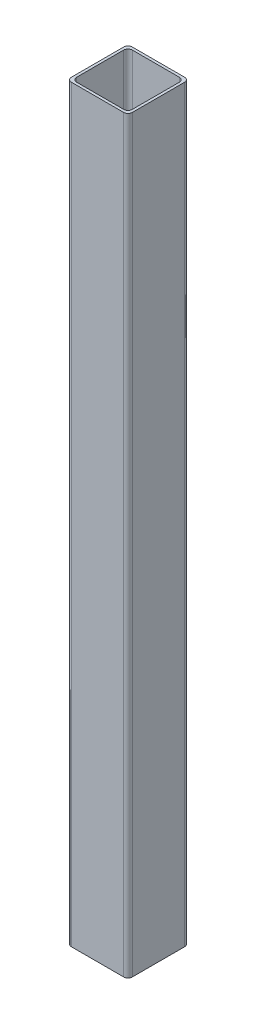
ISO-10303-21;
HEADER;
FILE_DESCRIPTION(('STEP AP214'),'2;1');
FILE_NAME('part.step','',(''),(''),'','','');
FILE_SCHEMA(('AUTOMOTIVE_DESIGN { 1 0 10303 214 1 1 1 1 }'));
ENDSEC;
DATA;
#1=APPLICATION_CONTEXT('core data for automotive mechanical design processes');
#2=APPLICATION_PROTOCOL_DEFINITION('international standard','automotive_design',2000,#1);
#3=PRODUCT_CONTEXT('',#1,'mechanical');
#4=PRODUCT('Part','Part','',(#3));
#5=PRODUCT_RELATED_PRODUCT_CATEGORY('part','',(#4));
#6=PRODUCT_DEFINITION_FORMATION('','',#4);
#7=PRODUCT_DEFINITION_CONTEXT('part definition',#1,'design');
#8=PRODUCT_DEFINITION('design','',#6,#7);
#9=PRODUCT_DEFINITION_SHAPE('','',#8);
#10=(LENGTH_UNIT() NAMED_UNIT(*) SI_UNIT(.MILLI.,.METRE.));
#11=(NAMED_UNIT(*) PLANE_ANGLE_UNIT() SI_UNIT($,.RADIAN.));
#12=(NAMED_UNIT(*) SI_UNIT($,.STERADIAN.) SOLID_ANGLE_UNIT());
#13=UNCERTAINTY_MEASURE_WITH_UNIT(LENGTH_MEASURE(1.E-05),#10,'distance_accuracy_value','');
#14=(GEOMETRIC_REPRESENTATION_CONTEXT(3) GLOBAL_UNCERTAINTY_ASSIGNED_CONTEXT((#13)) GLOBAL_UNIT_ASSIGNED_CONTEXT((#10,
#11,#12)) REPRESENTATION_CONTEXT('',''));
#15=CARTESIAN_POINT('',(0.,0.,0.));
#16=DIRECTION('',(0.,0.,1.));
#17=DIRECTION('',(1.,0.,0.));
#18=AXIS2_PLACEMENT_3D('',#15,#16,#17);
#19=CARTESIAN_POINT('',(0.,860.,0.));
#20=DIRECTION('',(0.,0.,-1.));
#21=DIRECTION('',(-1.,0.,0.));
#22=AXIS2_PLACEMENT_3D('',#19,#20,#21);
#23=PLANE('',#22);
#24=DIRECTION('',(1.,0.,0.));
#25=VECTOR('',#24,1.);
#26=CARTESIAN_POINT('',(0.,0.,0.));
#27=LINE('',#26,#25);
#28=CARTESIAN_POINT('',(5.,0.,0.));
#29=VERTEX_POINT('',#28);
#30=CARTESIAN_POINT('',(65.,0.,0.));
#31=VERTEX_POINT('',#30);
#32=EDGE_CURVE('E204',#29,#31,#27,.T.);
#33=ORIENTED_EDGE('',*,*,#32,.T.);
#34=DIRECTION('',(0.,-1.,0.));
#35=VECTOR('',#34,1.);
#36=CARTESIAN_POINT('',(65.,860.,0.));
#37=LINE('',#36,#35);
#38=CARTESIAN_POINT('',(65.,860.,0.));
#39=VERTEX_POINT('',#38);
#40=EDGE_CURVE('E182',#31,#39,#37,.F.);
#41=ORIENTED_EDGE('',*,*,#40,.T.);
#42=DIRECTION('',(1.,0.,0.));
#43=VECTOR('',#42,1.);
#44=CARTESIAN_POINT('',(0.,860.,0.));
#45=LINE('',#44,#43);
#46=CARTESIAN_POINT('',(5.,860.,0.));
#47=VERTEX_POINT('',#46);
#48=EDGE_CURVE('E214',#47,#39,#45,.T.);
#49=ORIENTED_EDGE('',*,*,#48,.F.);
#50=DIRECTION('',(0.,-1.,0.));
#51=VECTOR('',#50,1.);
#52=CARTESIAN_POINT('',(5.,0.,0.));
#53=LINE('',#52,#51);
#54=EDGE_CURVE('E187',#47,#29,#53,.T.);
#55=ORIENTED_EDGE('',*,*,#54,.T.);
#56=EDGE_LOOP('',(#33,#41,#49,#55));
#57=FACE_BOUND('',#56,.T.);
#58=ADVANCED_FACE('F63',(#57),#23,.F.);
#59=CARTESIAN_POINT('',(70.,860.,0.));
#60=DIRECTION('',(-1.,0.,0.));
#61=DIRECTION('',(0.,0.,1.));
#62=AXIS2_PLACEMENT_3D('',#59,#60,#61);
#63=PLANE('',#62);
#64=DIRECTION('',(0.,0.,-1.));
#65=VECTOR('',#64,1.);
#66=CARTESIAN_POINT('',(70.,860.,0.));
#67=LINE('',#66,#65);
#68=CARTESIAN_POINT('',(70.,860.,-5.));
#69=VERTEX_POINT('',#68);
#70=CARTESIAN_POINT('',(70.,860.,-65.));
#71=VERTEX_POINT('',#70);
#72=EDGE_CURVE('E197',#69,#71,#67,.T.);
#73=ORIENTED_EDGE('',*,*,#72,.F.);
#74=DIRECTION('',(0.,-1.,0.));
#75=VECTOR('',#74,1.);
#76=CARTESIAN_POINT('',(70.,860.,-5.));
#77=LINE('',#76,#75);
#78=CARTESIAN_POINT('',(70.,0.,-5.));
#79=VERTEX_POINT('',#78);
#80=EDGE_CURVE('E181',#69,#79,#77,.T.);
#81=ORIENTED_EDGE('',*,*,#80,.T.);
#82=DIRECTION('',(0.,0.,-1.));
#83=VECTOR('',#82,1.);
#84=CARTESIAN_POINT('',(70.,0.,0.));
#85=LINE('',#84,#83);
#86=CARTESIAN_POINT('',(70.,0.,-65.));
#87=VERTEX_POINT('',#86);
#88=EDGE_CURVE('E194',#79,#87,#85,.T.);
#89=ORIENTED_EDGE('',*,*,#88,.T.);
#90=DIRECTION('',(0.,-1.,0.));
#91=VECTOR('',#90,1.);
#92=CARTESIAN_POINT('',(70.,860.,-65.));
#93=LINE('',#92,#91);
#94=EDGE_CURVE('E199',#87,#71,#93,.F.);
#95=ORIENTED_EDGE('',*,*,#94,.T.);
#96=EDGE_LOOP('',(#73,#81,#89,#95));
#97=FACE_BOUND('',#96,.T.);
#98=ADVANCED_FACE('F193',(#97),#63,.F.);
#99=CARTESIAN_POINT('',(0.,860.,-70.));
#100=DIRECTION('',(0.,0.,-1.));
#101=DIRECTION('',(-1.,0.,0.));
#102=AXIS2_PLACEMENT_3D('',#99,#100,#101);
#103=PLANE('',#102);
#104=DIRECTION('',(1.,0.,0.));
#105=VECTOR('',#104,1.);
#106=CARTESIAN_POINT('',(0.,860.,-70.));
#107=LINE('',#106,#105);
#108=CARTESIAN_POINT('',(5.00000000000001,860.,-70.));
#109=VERTEX_POINT('',#108);
#110=CARTESIAN_POINT('',(65.,860.,-70.));
#111=VERTEX_POINT('',#110);
#112=EDGE_CURVE('E317',#109,#111,#107,.T.);
#113=ORIENTED_EDGE('',*,*,#112,.T.);
#114=DIRECTION('',(0.,-1.,0.));
#115=VECTOR('',#114,1.);
#116=CARTESIAN_POINT('',(65.,0.,-70.));
#117=LINE('',#116,#115);
#118=CARTESIAN_POINT('',(65.,0.,-70.));
#119=VERTEX_POINT('',#118);
#120=EDGE_CURVE('E243',#111,#119,#117,.T.);
#121=ORIENTED_EDGE('',*,*,#120,.T.);
#122=DIRECTION('',(1.,0.,0.));
#123=VECTOR('',#122,1.);
#124=CARTESIAN_POINT('',(0.,0.,-70.));
#125=LINE('',#124,#123);
#126=CARTESIAN_POINT('',(5.00000000000001,0.,-70.));
#127=VERTEX_POINT('',#126);
#128=EDGE_CURVE('E203',#127,#119,#125,.T.);
#129=ORIENTED_EDGE('',*,*,#128,.F.);
#130=DIRECTION('',(0.,-1.,0.));
#131=VECTOR('',#130,1.);
#132=CARTESIAN_POINT('',(5.00000000000001,860.,-70.));
#133=LINE('',#132,#131);
#134=EDGE_CURVE('E241',#127,#109,#133,.F.);
#135=ORIENTED_EDGE('',*,*,#134,.T.);
#136=EDGE_LOOP('',(#113,#121,#129,#135));
#137=FACE_BOUND('',#136,.T.);
#138=ADVANCED_FACE('F327',(#137),#103,.T.);
#139=CARTESIAN_POINT('',(0.,860.,0.));
#140=DIRECTION('',(-1.,0.,0.));
#141=DIRECTION('',(0.,0.,1.));
#142=AXIS2_PLACEMENT_3D('',#139,#140,#141);
#143=PLANE('',#142);
#144=DIRECTION('',(0.,0.,-1.));
#145=VECTOR('',#144,1.);
#146=CARTESIAN_POINT('',(0.,860.,0.));
#147=LINE('',#146,#145);
#148=CARTESIAN_POINT('',(0.,860.,-5.));
#149=VERTEX_POINT('',#148);
#150=CARTESIAN_POINT('',(0.,860.,-65.));
#151=VERTEX_POINT('',#150);
#152=EDGE_CURVE('E215',#149,#151,#147,.T.);
#153=ORIENTED_EDGE('',*,*,#152,.T.);
#154=DIRECTION('',(0.,-1.,0.));
#155=VECTOR('',#154,1.);
#156=CARTESIAN_POINT('',(0.,860.,-65.));
#157=LINE('',#156,#155);
#158=CARTESIAN_POINT('',(0.,0.,-65.));
#159=VERTEX_POINT('',#158);
#160=EDGE_CURVE('E257',#151,#159,#157,.T.);
#161=ORIENTED_EDGE('',*,*,#160,.T.);
#162=DIRECTION('',(0.,0.,-1.));
#163=VECTOR('',#162,1.);
#164=CARTESIAN_POINT('',(0.,0.,0.));
#165=LINE('',#164,#163);
#166=CARTESIAN_POINT('',(0.,0.,-5.));
#167=VERTEX_POINT('',#166);
#168=EDGE_CURVE('E206',#167,#159,#165,.T.);
#169=ORIENTED_EDGE('',*,*,#168,.F.);
#170=DIRECTION('',(0.,-1.,0.));
#171=VECTOR('',#170,1.);
#172=CARTESIAN_POINT('',(0.,860.,-5.));
#173=LINE('',#172,#171);
#174=EDGE_CURVE('E85',#167,#149,#173,.F.);
#175=ORIENTED_EDGE('',*,*,#174,.T.);
#176=EDGE_LOOP('',(#153,#161,#169,#175));
#177=FACE_BOUND('',#176,.T.);
#178=ADVANCED_FACE('F320',(#177),#143,.T.);
#179=CARTESIAN_POINT('',(0.,860.,0.));
#180=DIRECTION('',(0.,1.,0.));
#181=DIRECTION('',(0.,0.,1.));
#182=AXIS2_PLACEMENT_3D('',#179,#180,#181);
#183=PLANE('',#182);
#184=DIRECTION('',(1.,0.,0.));
#185=VECTOR('',#184,1.);
#186=CARTESIAN_POINT('',(3.,860.,-3.));
#187=LINE('',#186,#185);
#188=CARTESIAN_POINT('',(8.,860.,-3.));
#189=VERTEX_POINT('',#188);
#190=CARTESIAN_POINT('',(62.,860.,-3.));
#191=VERTEX_POINT('',#190);
#192=EDGE_CURVE('E208',#189,#191,#187,.T.);
#193=ORIENTED_EDGE('',*,*,#192,.F.);
#194=CARTESIAN_POINT('',(8.,860.,-8.));
#195=DIRECTION('',(0.,1.,0.));
#196=DIRECTION('',(0.,0.,1.));
#197=AXIS2_PLACEMENT_3D('',#194,#195,#196);
#198=CIRCLE('',#197,5.);
#199=CARTESIAN_POINT('',(3.,860.,-8.));
#200=VERTEX_POINT('',#199);
#201=EDGE_CURVE('E12',#189,#200,#198,.F.);
#202=ORIENTED_EDGE('',*,*,#201,.T.);
#203=DIRECTION('',(0.,0.,-1.));
#204=VECTOR('',#203,1.);
#205=CARTESIAN_POINT('',(3.,860.,-3.));
#206=LINE('',#205,#204);
#207=CARTESIAN_POINT('',(3.,860.,-62.));
#208=VERTEX_POINT('',#207);
#209=EDGE_CURVE('E287',#200,#208,#206,.T.);
#210=ORIENTED_EDGE('',*,*,#209,.T.);
#211=CARTESIAN_POINT('',(8.,860.,-62.));
#212=DIRECTION('',(0.,1.,0.));
#213=DIRECTION('',(0.,0.,1.));
#214=AXIS2_PLACEMENT_3D('',#211,#212,#213);
#215=CIRCLE('',#214,5.);
#216=CARTESIAN_POINT('',(8.,860.,-67.));
#217=VERTEX_POINT('',#216);
#218=EDGE_CURVE('E270',#208,#217,#215,.F.);
#219=ORIENTED_EDGE('',*,*,#218,.T.);
#220=DIRECTION('',(1.,0.,0.));
#221=VECTOR('',#220,1.);
#222=CARTESIAN_POINT('',(3.,860.,-67.));
#223=LINE('',#222,#221);
#224=CARTESIAN_POINT('',(62.,860.,-67.));
#225=VERTEX_POINT('',#224);
#226=EDGE_CURVE('E299',#217,#225,#223,.T.);
#227=ORIENTED_EDGE('',*,*,#226,.T.);
#228=CARTESIAN_POINT('',(62.,860.,-62.));
#229=DIRECTION('',(0.,1.,0.));
#230=DIRECTION('',(0.,0.,1.));
#231=AXIS2_PLACEMENT_3D('',#228,#229,#230);
#232=CIRCLE('',#231,5.);
#233=CARTESIAN_POINT('',(67.,860.,-62.));
#234=VERTEX_POINT('',#233);
#235=EDGE_CURVE('E266',#225,#234,#232,.F.);
#236=ORIENTED_EDGE('',*,*,#235,.T.);
#237=DIRECTION('',(0.,0.,-1.));
#238=VECTOR('',#237,1.);
#239=CARTESIAN_POINT('',(67.,860.,-3.));
#240=LINE('',#239,#238);
#241=CARTESIAN_POINT('',(67.,860.,-8.));
#242=VERTEX_POINT('',#241);
#243=EDGE_CURVE('E302',#242,#234,#240,.T.);
#244=ORIENTED_EDGE('',*,*,#243,.F.);
#245=CARTESIAN_POINT('',(62.,860.,-8.));
#246=DIRECTION('',(0.,1.,0.));
#247=DIRECTION('',(0.,0.,1.));
#248=AXIS2_PLACEMENT_3D('',#245,#246,#247);
#249=CIRCLE('',#248,5.);
#250=EDGE_CURVE('E262',#242,#191,#249,.F.);
#251=ORIENTED_EDGE('',*,*,#250,.T.);
#252=EDGE_LOOP('',(#193,#202,#210,#219,#227,#236,#244,#251));
#253=FACE_BOUND('',#252,.T.);
#254=ORIENTED_EDGE('',*,*,#48,.T.);
#255=CARTESIAN_POINT('',(65.,860.,-5.));
#256=DIRECTION('',(0.,1.,0.));
#257=DIRECTION('',(0.,0.,1.));
#258=AXIS2_PLACEMENT_3D('',#255,#256,#257);
#259=CIRCLE('',#258,5.);
#260=EDGE_CURVE('E229',#39,#69,#259,.T.);
#261=ORIENTED_EDGE('',*,*,#260,.T.);
#262=ORIENTED_EDGE('',*,*,#72,.T.);
#263=CARTESIAN_POINT('',(65.,860.,-65.));
#264=DIRECTION('',(0.,1.,0.));
#265=DIRECTION('',(0.,0.,1.));
#266=AXIS2_PLACEMENT_3D('',#263,#264,#265);
#267=CIRCLE('',#266,5.);
#268=EDGE_CURVE('E227',#71,#111,#267,.T.);
#269=ORIENTED_EDGE('',*,*,#268,.T.);
#270=ORIENTED_EDGE('',*,*,#112,.F.);
#271=CARTESIAN_POINT('',(5.00000000000001,860.,-65.));
#272=DIRECTION('',(0.,1.,0.));
#273=DIRECTION('',(0.,0.,1.));
#274=AXIS2_PLACEMENT_3D('',#271,#272,#273);
#275=CIRCLE('',#274,5.);
#276=EDGE_CURVE('E78',#109,#151,#275,.T.);
#277=ORIENTED_EDGE('',*,*,#276,.T.);
#278=ORIENTED_EDGE('',*,*,#152,.F.);
#279=CARTESIAN_POINT('',(5.,860.,-5.));
#280=DIRECTION('',(0.,1.,0.));
#281=DIRECTION('',(0.,0.,1.));
#282=AXIS2_PLACEMENT_3D('',#279,#280,#281);
#283=CIRCLE('',#282,5.);
#284=EDGE_CURVE('E224',#149,#47,#283,.T.);
#285=ORIENTED_EDGE('',*,*,#284,.T.);
#286=EDGE_LOOP('',(#254,#261,#262,#269,#270,#277,#278,#285));
#287=FACE_BOUND('',#286,.T.);
#288=ADVANCED_FACE('F294',(#253,#287),#183,.T.);
#289=CARTESIAN_POINT('',(0.,0.,0.));
#290=DIRECTION('',(0.,1.,0.));
#291=DIRECTION('',(0.,0.,1.));
#292=AXIS2_PLACEMENT_3D('',#289,#290,#291);
#293=PLANE('',#292);
#294=DIRECTION('',(1.,0.,0.));
#295=VECTOR('',#294,1.);
#296=CARTESIAN_POINT('',(3.,0.,-67.));
#297=LINE('',#296,#295);
#298=CARTESIAN_POINT('',(8.,0.,-67.));
#299=VERTEX_POINT('',#298);
#300=CARTESIAN_POINT('',(62.,0.,-67.));
#301=VERTEX_POINT('',#300);
#302=EDGE_CURVE('E309',#299,#301,#297,.T.);
#303=ORIENTED_EDGE('',*,*,#302,.F.);
#304=CARTESIAN_POINT('',(8.,0.,-62.));
#305=DIRECTION('',(0.,1.,0.));
#306=DIRECTION('',(0.,0.,1.));
#307=AXIS2_PLACEMENT_3D('',#304,#305,#306);
#308=CIRCLE('',#307,5.);
#309=CARTESIAN_POINT('',(3.,0.,-62.));
#310=VERTEX_POINT('',#309);
#311=EDGE_CURVE('E268',#299,#310,#308,.T.);
#312=ORIENTED_EDGE('',*,*,#311,.T.);
#313=DIRECTION('',(0.,0.,-1.));
#314=VECTOR('',#313,1.);
#315=CARTESIAN_POINT('',(3.,0.,-3.));
#316=LINE('',#315,#314);
#317=CARTESIAN_POINT('',(3.,0.,-8.));
#318=VERTEX_POINT('',#317);
#319=EDGE_CURVE('E278',#318,#310,#316,.T.);
#320=ORIENTED_EDGE('',*,*,#319,.F.);
#321=CARTESIAN_POINT('',(8.,0.,-8.));
#322=DIRECTION('',(0.,1.,0.));
#323=DIRECTION('',(0.,0.,1.));
#324=AXIS2_PLACEMENT_3D('',#321,#322,#323);
#325=CIRCLE('',#324,5.);
#326=CARTESIAN_POINT('',(8.,0.,-3.));
#327=VERTEX_POINT('',#326);
#328=EDGE_CURVE('E71',#318,#327,#325,.T.);
#329=ORIENTED_EDGE('',*,*,#328,.T.);
#330=DIRECTION('',(1.,0.,0.));
#331=VECTOR('',#330,1.);
#332=CARTESIAN_POINT('',(3.,0.,-3.));
#333=LINE('',#332,#331);
#334=CARTESIAN_POINT('',(62.,0.,-3.));
#335=VERTEX_POINT('',#334);
#336=EDGE_CURVE('E276',#327,#335,#333,.T.);
#337=ORIENTED_EDGE('',*,*,#336,.T.);
#338=CARTESIAN_POINT('',(62.,0.,-8.));
#339=DIRECTION('',(0.,1.,0.));
#340=DIRECTION('',(0.,0.,1.));
#341=AXIS2_PLACEMENT_3D('',#338,#339,#340);
#342=CIRCLE('',#341,5.);
#343=CARTESIAN_POINT('',(67.,0.,-8.));
#344=VERTEX_POINT('',#343);
#345=EDGE_CURVE('E260',#335,#344,#342,.T.);
#346=ORIENTED_EDGE('',*,*,#345,.T.);
#347=DIRECTION('',(0.,0.,-1.));
#348=VECTOR('',#347,1.);
#349=CARTESIAN_POINT('',(67.,0.,-3.));
#350=LINE('',#349,#348);
#351=CARTESIAN_POINT('',(67.,0.,-62.));
#352=VERTEX_POINT('',#351);
#353=EDGE_CURVE('E288',#344,#352,#350,.T.);
#354=ORIENTED_EDGE('',*,*,#353,.T.);
#355=CARTESIAN_POINT('',(62.,0.,-62.));
#356=DIRECTION('',(0.,1.,0.));
#357=DIRECTION('',(0.,0.,1.));
#358=AXIS2_PLACEMENT_3D('',#355,#356,#357);
#359=CIRCLE('',#358,5.);
#360=EDGE_CURVE('E264',#352,#301,#359,.T.);
#361=ORIENTED_EDGE('',*,*,#360,.T.);
#362=EDGE_LOOP('',(#303,#312,#320,#329,#337,#346,#354,#361));
#363=FACE_BOUND('',#362,.T.);
#364=ORIENTED_EDGE('',*,*,#88,.F.);
#365=CARTESIAN_POINT('',(65.,0.,-5.));
#366=DIRECTION('',(0.,1.,0.));
#367=DIRECTION('',(0.,0.,1.));
#368=AXIS2_PLACEMENT_3D('',#365,#366,#367);
#369=CIRCLE('',#368,5.);
#370=EDGE_CURVE('E177',#79,#31,#369,.F.);
#371=ORIENTED_EDGE('',*,*,#370,.T.);
#372=ORIENTED_EDGE('',*,*,#32,.F.);
#373=CARTESIAN_POINT('',(5.,0.,-5.));
#374=DIRECTION('',(0.,1.,0.));
#375=DIRECTION('',(0.,0.,1.));
#376=AXIS2_PLACEMENT_3D('',#373,#374,#375);
#377=CIRCLE('',#376,5.);
#378=EDGE_CURVE('E198',#29,#167,#377,.F.);
#379=ORIENTED_EDGE('',*,*,#378,.T.);
#380=ORIENTED_EDGE('',*,*,#168,.T.);
#381=CARTESIAN_POINT('',(5.00000000000001,0.,-65.));
#382=DIRECTION('',(0.,1.,0.));
#383=DIRECTION('',(0.,0.,1.));
#384=AXIS2_PLACEMENT_3D('',#381,#382,#383);
#385=CIRCLE('',#384,5.);
#386=EDGE_CURVE('E218',#159,#127,#385,.F.);
#387=ORIENTED_EDGE('',*,*,#386,.T.);
#388=ORIENTED_EDGE('',*,*,#128,.T.);
#389=CARTESIAN_POINT('',(65.,0.,-65.));
#390=DIRECTION('',(0.,1.,0.));
#391=DIRECTION('',(0.,0.,1.));
#392=AXIS2_PLACEMENT_3D('',#389,#390,#391);
#393=CIRCLE('',#392,5.);
#394=EDGE_CURVE('E188',#119,#87,#393,.F.);
#395=ORIENTED_EDGE('',*,*,#394,.T.);
#396=EDGE_LOOP('',(#364,#371,#372,#379,#380,#387,#388,#395));
#397=FACE_BOUND('',#396,.T.);
#398=ADVANCED_FACE('F201',(#363,#397),#293,.F.);
#399=CARTESIAN_POINT('',(3.,860.,-3.));
#400=DIRECTION('',(-1.,0.,0.));
#401=DIRECTION('',(0.,0.,1.));
#402=AXIS2_PLACEMENT_3D('',#399,#400,#401);
#403=PLANE('',#402);
#404=ORIENTED_EDGE('',*,*,#319,.T.);
#405=DIRECTION('',(0.,-1.,0.));
#406=VECTOR('',#405,1.);
#407=CARTESIAN_POINT('',(3.,860.,-62.));
#408=LINE('',#407,#406);
#409=EDGE_CURVE('E254',#310,#208,#408,.F.);
#410=ORIENTED_EDGE('',*,*,#409,.T.);
#411=ORIENTED_EDGE('',*,*,#209,.F.);
#412=DIRECTION('',(0.,-1.,0.));
#413=VECTOR('',#412,1.);
#414=CARTESIAN_POINT('',(3.,860.,-8.));
#415=LINE('',#414,#413);
#416=EDGE_CURVE('E251',#200,#318,#415,.T.);
#417=ORIENTED_EDGE('',*,*,#416,.T.);
#418=EDGE_LOOP('',(#404,#410,#411,#417));
#419=FACE_BOUND('',#418,.T.);
#420=ADVANCED_FACE('F297',(#419),#403,.F.);
#421=CARTESIAN_POINT('',(3.,860.,-3.));
#422=DIRECTION('',(0.,0.,-1.));
#423=DIRECTION('',(-1.,0.,0.));
#424=AXIS2_PLACEMENT_3D('',#421,#422,#423);
#425=PLANE('',#424);
#426=ORIENTED_EDGE('',*,*,#192,.T.);
#427=DIRECTION('',(0.,-1.,0.));
#428=VECTOR('',#427,1.);
#429=CARTESIAN_POINT('',(62.,0.,-3.));
#430=LINE('',#429,#428);
#431=EDGE_CURVE('E233',#191,#335,#430,.T.);
#432=ORIENTED_EDGE('',*,*,#431,.T.);
#433=ORIENTED_EDGE('',*,*,#336,.F.);
#434=DIRECTION('',(0.,-1.,0.));
#435=VECTOR('',#434,1.);
#436=CARTESIAN_POINT('',(8.,860.,-3.));
#437=LINE('',#436,#435);
#438=EDGE_CURVE('E231',#327,#189,#437,.F.);
#439=ORIENTED_EDGE('',*,*,#438,.T.);
#440=EDGE_LOOP('',(#426,#432,#433,#439));
#441=FACE_BOUND('',#440,.T.);
#442=ADVANCED_FACE('F284',(#441),#425,.T.);
#443=CARTESIAN_POINT('',(67.,860.,-3.));
#444=DIRECTION('',(-1.,0.,0.));
#445=DIRECTION('',(0.,0.,1.));
#446=AXIS2_PLACEMENT_3D('',#443,#444,#445);
#447=PLANE('',#446);
#448=ORIENTED_EDGE('',*,*,#353,.F.);
#449=DIRECTION('',(0.,-1.,0.));
#450=VECTOR('',#449,1.);
#451=CARTESIAN_POINT('',(67.,860.,-8.));
#452=LINE('',#451,#450);
#453=EDGE_CURVE('E239',#344,#242,#452,.F.);
#454=ORIENTED_EDGE('',*,*,#453,.T.);
#455=ORIENTED_EDGE('',*,*,#243,.T.);
#456=DIRECTION('',(0.,-1.,0.));
#457=VECTOR('',#456,1.);
#458=CARTESIAN_POINT('',(67.,860.,-62.));
#459=LINE('',#458,#457);
#460=EDGE_CURVE('E236',#234,#352,#459,.T.);
#461=ORIENTED_EDGE('',*,*,#460,.T.);
#462=EDGE_LOOP('',(#448,#454,#455,#461));
#463=FACE_BOUND('',#462,.T.);
#464=ADVANCED_FACE('F379',(#463),#447,.T.);
#465=CARTESIAN_POINT('',(3.,860.,-67.));
#466=DIRECTION('',(0.,0.,-1.));
#467=DIRECTION('',(-1.,0.,0.));
#468=AXIS2_PLACEMENT_3D('',#465,#466,#467);
#469=PLANE('',#468);
#470=ORIENTED_EDGE('',*,*,#302,.T.);
#471=DIRECTION('',(0.,-1.,0.));
#472=VECTOR('',#471,1.);
#473=CARTESIAN_POINT('',(62.,860.,-67.));
#474=LINE('',#473,#472);
#475=EDGE_CURVE('E249',#301,#225,#474,.F.);
#476=ORIENTED_EDGE('',*,*,#475,.T.);
#477=ORIENTED_EDGE('',*,*,#226,.F.);
#478=DIRECTION('',(0.,-1.,0.));
#479=VECTOR('',#478,1.);
#480=CARTESIAN_POINT('',(8.,0.,-67.));
#481=LINE('',#480,#479);
#482=EDGE_CURVE('E246',#217,#299,#481,.T.);
#483=ORIENTED_EDGE('',*,*,#482,.T.);
#484=EDGE_LOOP('',(#470,#476,#477,#483));
#485=FACE_BOUND('',#484,.T.);
#486=ADVANCED_FACE('F355',(#485),#469,.F.);
#487=CARTESIAN_POINT('',(65.,860.,-5.));
#488=DIRECTION('',(0.,-1.,0.));
#489=DIRECTION('',(0.,0.,-1.));
#490=AXIS2_PLACEMENT_3D('',#487,#488,#489);
#491=CYLINDRICAL_SURFACE('',#490,5.);
#492=ORIENTED_EDGE('',*,*,#260,.F.);
#493=ORIENTED_EDGE('',*,*,#40,.F.);
#494=ORIENTED_EDGE('',*,*,#370,.F.);
#495=ORIENTED_EDGE('',*,*,#80,.F.);
#496=EDGE_LOOP('',(#492,#493,#494,#495));
#497=FACE_BOUND('',#496,.T.);
#498=ADVANCED_FACE('F180',(#497),#491,.T.);
#499=CARTESIAN_POINT('',(62.,860.,-8.));
#500=DIRECTION('',(0.,1.,0.));
#501=DIRECTION('',(0.,0.,1.));
#502=AXIS2_PLACEMENT_3D('',#499,#500,#501);
#503=CYLINDRICAL_SURFACE('',#502,5.);
#504=ORIENTED_EDGE('',*,*,#250,.F.);
#505=ORIENTED_EDGE('',*,*,#453,.F.);
#506=ORIENTED_EDGE('',*,*,#345,.F.);
#507=ORIENTED_EDGE('',*,*,#431,.F.);
#508=EDGE_LOOP('',(#504,#505,#506,#507));
#509=FACE_BOUND('',#508,.T.);
#510=ADVANCED_FACE('F354',(#509),#503,.F.);
#511=CARTESIAN_POINT('',(65.,860.,-65.));
#512=DIRECTION('',(0.,1.,0.));
#513=DIRECTION('',(0.,0.,1.));
#514=AXIS2_PLACEMENT_3D('',#511,#512,#513);
#515=CYLINDRICAL_SURFACE('',#514,5.);
#516=ORIENTED_EDGE('',*,*,#268,.F.);
#517=ORIENTED_EDGE('',*,*,#94,.F.);
#518=ORIENTED_EDGE('',*,*,#394,.F.);
#519=ORIENTED_EDGE('',*,*,#120,.F.);
#520=EDGE_LOOP('',(#516,#517,#518,#519));
#521=FACE_BOUND('',#520,.T.);
#522=ADVANCED_FACE('F331',(#521),#515,.T.);
#523=CARTESIAN_POINT('',(62.,860.,-62.));
#524=DIRECTION('',(0.,-1.,0.));
#525=DIRECTION('',(0.,0.,-1.));
#526=AXIS2_PLACEMENT_3D('',#523,#524,#525);
#527=CYLINDRICAL_SURFACE('',#526,5.);
#528=ORIENTED_EDGE('',*,*,#235,.F.);
#529=ORIENTED_EDGE('',*,*,#475,.F.);
#530=ORIENTED_EDGE('',*,*,#360,.F.);
#531=ORIENTED_EDGE('',*,*,#460,.F.);
#532=EDGE_LOOP('',(#528,#529,#530,#531));
#533=FACE_BOUND('',#532,.T.);
#534=ADVANCED_FACE('F361',(#533),#527,.F.);
#535=CARTESIAN_POINT('',(8.,860.,-62.));
#536=DIRECTION('',(0.,1.,0.));
#537=DIRECTION('',(0.,0.,1.));
#538=AXIS2_PLACEMENT_3D('',#535,#536,#537);
#539=CYLINDRICAL_SURFACE('',#538,5.);
#540=ORIENTED_EDGE('',*,*,#218,.F.);
#541=ORIENTED_EDGE('',*,*,#409,.F.);
#542=ORIENTED_EDGE('',*,*,#311,.F.);
#543=ORIENTED_EDGE('',*,*,#482,.F.);
#544=EDGE_LOOP('',(#540,#541,#542,#543));
#545=FACE_BOUND('',#544,.T.);
#546=ADVANCED_FACE('F342',(#545),#539,.F.);
#547=CARTESIAN_POINT('',(5.00000000000001,860.,-65.));
#548=DIRECTION('',(0.,-1.,0.));
#549=DIRECTION('',(0.,0.,-1.));
#550=AXIS2_PLACEMENT_3D('',#547,#548,#549);
#551=CYLINDRICAL_SURFACE('',#550,5.);
#552=ORIENTED_EDGE('',*,*,#276,.F.);
#553=ORIENTED_EDGE('',*,*,#134,.F.);
#554=ORIENTED_EDGE('',*,*,#386,.F.);
#555=ORIENTED_EDGE('',*,*,#160,.F.);
#556=EDGE_LOOP('',(#552,#553,#554,#555));
#557=FACE_BOUND('',#556,.T.);
#558=ADVANCED_FACE('F323',(#557),#551,.T.);
#559=CARTESIAN_POINT('',(5.,860.,-5.));
#560=DIRECTION('',(0.,1.,0.));
#561=DIRECTION('',(0.,0.,1.));
#562=AXIS2_PLACEMENT_3D('',#559,#560,#561);
#563=CYLINDRICAL_SURFACE('',#562,5.);
#564=ORIENTED_EDGE('',*,*,#284,.F.);
#565=ORIENTED_EDGE('',*,*,#174,.F.);
#566=ORIENTED_EDGE('',*,*,#378,.F.);
#567=ORIENTED_EDGE('',*,*,#54,.F.);
#568=EDGE_LOOP('',(#564,#565,#566,#567));
#569=FACE_BOUND('',#568,.T.);
#570=ADVANCED_FACE('F336',(#569),#563,.T.);
#571=CARTESIAN_POINT('',(8.,860.,-8.));
#572=DIRECTION('',(0.,-1.,0.));
#573=DIRECTION('',(0.,0.,-1.));
#574=AXIS2_PLACEMENT_3D('',#571,#572,#573);
#575=CYLINDRICAL_SURFACE('',#574,5.);
#576=ORIENTED_EDGE('',*,*,#201,.F.);
#577=ORIENTED_EDGE('',*,*,#438,.F.);
#578=ORIENTED_EDGE('',*,*,#328,.F.);
#579=ORIENTED_EDGE('',*,*,#416,.F.);
#580=EDGE_LOOP('',(#576,#577,#578,#579));
#581=FACE_BOUND('',#580,.T.);
#582=ADVANCED_FACE('F65',(#581),#575,.F.);
#583=CLOSED_SHELL('',(#58,#98,#138,#178,#288,#398,#420,#442,#464,#486,#498,#510,#522,#534,#546,
#558,#570,#582));
#584=MANIFOLD_SOLID_BREP('B2',#583);
#585=ADVANCED_BREP_SHAPE_REPRESENTATION('',(#18,#584),#14);
#586=SHAPE_DEFINITION_REPRESENTATION(#9,#585);
ENDSEC;
END-ISO-10303-21;
